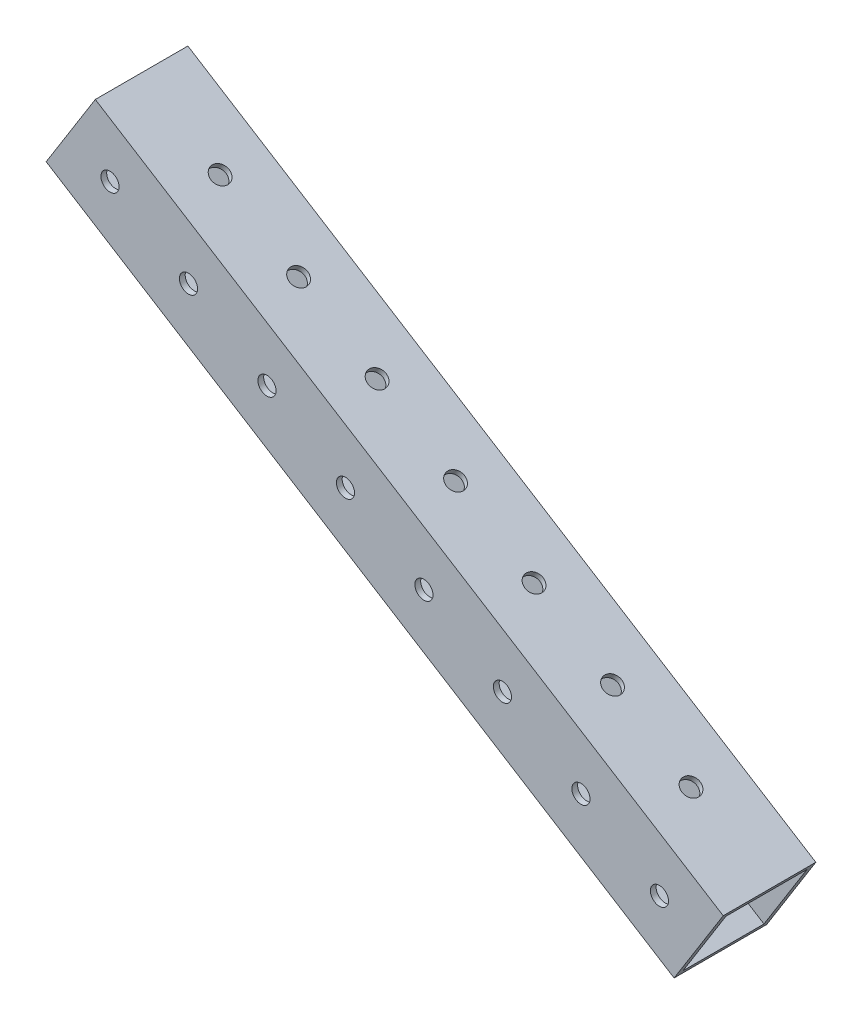
ISO-10303-21;
HEADER;
FILE_DESCRIPTION(('STEP AP214'),'2;1');
FILE_NAME('part.step','',(''),(''),'','','');
FILE_SCHEMA(('AUTOMOTIVE_DESIGN { 1 0 10303 214 1 1 1 1 }'));
ENDSEC;
DATA;
#1=APPLICATION_CONTEXT('core data for automotive mechanical design processes');
#2=APPLICATION_PROTOCOL_DEFINITION('international standard','automotive_design',2000,#1);
#3=PRODUCT_CONTEXT('',#1,'mechanical');
#4=PRODUCT('Part','Part','',(#3));
#5=PRODUCT_RELATED_PRODUCT_CATEGORY('part','',(#4));
#6=PRODUCT_DEFINITION_FORMATION('','',#4);
#7=PRODUCT_DEFINITION_CONTEXT('part definition',#1,'design');
#8=PRODUCT_DEFINITION('design','',#6,#7);
#9=PRODUCT_DEFINITION_SHAPE('','',#8);
#10=(LENGTH_UNIT() NAMED_UNIT(*) SI_UNIT(.MILLI.,.METRE.));
#11=(NAMED_UNIT(*) PLANE_ANGLE_UNIT() SI_UNIT($,.RADIAN.));
#12=(NAMED_UNIT(*) SI_UNIT($,.STERADIAN.) SOLID_ANGLE_UNIT());
#13=UNCERTAINTY_MEASURE_WITH_UNIT(LENGTH_MEASURE(1.E-05),#10,'distance_accuracy_value','');
#14=(GEOMETRIC_REPRESENTATION_CONTEXT(3) GLOBAL_UNCERTAINTY_ASSIGNED_CONTEXT((#13)) GLOBAL_UNIT_ASSIGNED_CONTEXT((#10,
#11,#12)) REPRESENTATION_CONTEXT('',''));
#15=CARTESIAN_POINT('',(0.,0.,0.));
#16=DIRECTION('',(0.,0.,1.));
#17=DIRECTION('',(1.,0.,0.));
#18=AXIS2_PLACEMENT_3D('',#15,#16,#17);
#19=CARTESIAN_POINT('',(108.430376731057,810.225785303285,25.4));
#20=DIRECTION('',(0.,0.,-1.));
#21=DIRECTION('',(-1.,0.,0.));
#22=AXIS2_PLACEMENT_3D('',#19,#20,#21);
#23=CYLINDRICAL_SURFACE('',#22,2.48919999999999);
#24=CARTESIAN_POINT('',(108.430376731057,810.225785303285,1.5875));
#25=DIRECTION('',(0.,0.,-1.));
#26=DIRECTION('',(0.,1.,0.));
#27=AXIS2_PLACEMENT_3D('',#24,#25,#26);
#28=CIRCLE('',#27,2.48919999999999);
#29=CARTESIAN_POINT('',(108.430376731057,812.714985303285,1.5875));
#30=VERTEX_POINT('',#29);
#31=EDGE_CURVE('E180',#30,#30,#28,.T.);
#32=ORIENTED_EDGE('',*,*,#31,.F.);
#33=EDGE_LOOP('',(#32));
#34=FACE_BOUND('',#33,.T.);
#35=CARTESIAN_POINT('',(108.430376731057,810.225785303285,0.));
#36=DIRECTION('',(0.,0.,1.));
#37=DIRECTION('',(1.,0.,0.));
#38=AXIS2_PLACEMENT_3D('',#35,#36,#37);
#39=CIRCLE('',#38,2.48919999999999);
#40=CARTESIAN_POINT('',(110.919576731057,810.225785303285,0.));
#41=VERTEX_POINT('',#40);
#42=EDGE_CURVE('E226',#41,#41,#39,.T.);
#43=ORIENTED_EDGE('',*,*,#42,.F.);
#44=EDGE_LOOP('',(#43));
#45=FACE_BOUND('',#44,.T.);
#46=ADVANCED_FACE('F43',(#34,#45),#23,.F.);
#47=CARTESIAN_POINT('',(129.961835950274,796.751503730926,25.4));
#48=DIRECTION('',(0.,0.,-1.));
#49=DIRECTION('',(-1.,0.,0.));
#50=AXIS2_PLACEMENT_3D('',#47,#48,#49);
#51=CYLINDRICAL_SURFACE('',#50,2.48919999999999);
#52=CARTESIAN_POINT('',(129.961835950274,796.751503730926,1.5875));
#53=DIRECTION('',(0.,0.,-1.));
#54=DIRECTION('',(0.,1.,0.));
#55=AXIS2_PLACEMENT_3D('',#52,#53,#54);
#56=CIRCLE('',#55,2.48919999999999);
#57=CARTESIAN_POINT('',(129.961835950274,799.240703730926,1.5875));
#58=VERTEX_POINT('',#57);
#59=EDGE_CURVE('E177',#58,#58,#56,.T.);
#60=ORIENTED_EDGE('',*,*,#59,.F.);
#61=EDGE_LOOP('',(#60));
#62=FACE_BOUND('',#61,.T.);
#63=CARTESIAN_POINT('',(129.961835950274,796.751503730926,0.));
#64=DIRECTION('',(0.,0.,1.));
#65=DIRECTION('',(1.,0.,0.));
#66=AXIS2_PLACEMENT_3D('',#63,#64,#65);
#67=CIRCLE('',#66,2.48919999999999);
#68=CARTESIAN_POINT('',(132.451035950274,796.751503730926,0.));
#69=VERTEX_POINT('',#68);
#70=EDGE_CURVE('E220',#69,#69,#67,.T.);
#71=ORIENTED_EDGE('',*,*,#70,.F.);
#72=EDGE_LOOP('',(#71));
#73=FACE_BOUND('',#72,.T.);
#74=ADVANCED_FACE('F361',(#62,#73),#51,.F.);
#75=CARTESIAN_POINT('',(151.49329516949,783.277222158567,25.4));
#76=DIRECTION('',(0.,0.,-1.));
#77=DIRECTION('',(-1.,0.,0.));
#78=AXIS2_PLACEMENT_3D('',#75,#76,#77);
#79=CYLINDRICAL_SURFACE('',#78,2.48919999999999);
#80=CARTESIAN_POINT('',(151.49329516949,783.277222158567,1.5875));
#81=DIRECTION('',(0.,0.,-1.));
#82=DIRECTION('',(0.,1.,0.));
#83=AXIS2_PLACEMENT_3D('',#80,#81,#82);
#84=CIRCLE('',#83,2.48919999999999);
#85=CARTESIAN_POINT('',(151.49329516949,785.766422158567,1.5875));
#86=VERTEX_POINT('',#85);
#87=EDGE_CURVE('E174',#86,#86,#84,.T.);
#88=ORIENTED_EDGE('',*,*,#87,.F.);
#89=EDGE_LOOP('',(#88));
#90=FACE_BOUND('',#89,.T.);
#91=CARTESIAN_POINT('',(151.49329516949,783.277222158567,0.));
#92=DIRECTION('',(0.,0.,1.));
#93=DIRECTION('',(1.,0.,0.));
#94=AXIS2_PLACEMENT_3D('',#91,#92,#93);
#95=CIRCLE('',#94,2.48919999999999);
#96=CARTESIAN_POINT('',(153.98249516949,783.277222158567,0.));
#97=VERTEX_POINT('',#96);
#98=EDGE_CURVE('E214',#97,#97,#95,.T.);
#99=ORIENTED_EDGE('',*,*,#98,.F.);
#100=EDGE_LOOP('',(#99));
#101=FACE_BOUND('',#100,.T.);
#102=ADVANCED_FACE('F367',(#90,#101),#79,.F.);
#103=CARTESIAN_POINT('',(173.024754388706,769.802940586208,25.4));
#104=DIRECTION('',(0.,0.,-1.));
#105=DIRECTION('',(-1.,0.,0.));
#106=AXIS2_PLACEMENT_3D('',#103,#104,#105);
#107=CYLINDRICAL_SURFACE('',#106,2.48919999999999);
#108=CARTESIAN_POINT('',(173.024754388706,769.802940586208,1.5875));
#109=DIRECTION('',(0.,0.,-1.));
#110=DIRECTION('',(0.,1.,0.));
#111=AXIS2_PLACEMENT_3D('',#108,#109,#110);
#112=CIRCLE('',#111,2.48919999999999);
#113=CARTESIAN_POINT('',(173.024754388706,772.292140586208,1.5875));
#114=VERTEX_POINT('',#113);
#115=EDGE_CURVE('E171',#114,#114,#112,.T.);
#116=ORIENTED_EDGE('',*,*,#115,.F.);
#117=EDGE_LOOP('',(#116));
#118=FACE_BOUND('',#117,.T.);
#119=CARTESIAN_POINT('',(173.024754388706,769.802940586208,0.));
#120=DIRECTION('',(0.,0.,1.));
#121=DIRECTION('',(1.,0.,0.));
#122=AXIS2_PLACEMENT_3D('',#119,#120,#121);
#123=CIRCLE('',#122,2.48919999999999);
#124=CARTESIAN_POINT('',(175.513954388706,769.802940586208,0.));
#125=VERTEX_POINT('',#124);
#126=EDGE_CURVE('E208',#125,#125,#123,.T.);
#127=ORIENTED_EDGE('',*,*,#126,.F.);
#128=EDGE_LOOP('',(#127));
#129=FACE_BOUND('',#128,.T.);
#130=ADVANCED_FACE('F443',(#118,#129),#107,.F.);
#131=CARTESIAN_POINT('',(194.556213607923,756.328659013849,25.4));
#132=DIRECTION('',(0.,0.,-1.));
#133=DIRECTION('',(-1.,0.,0.));
#134=AXIS2_PLACEMENT_3D('',#131,#132,#133);
#135=CYLINDRICAL_SURFACE('',#134,2.48919999999999);
#136=CARTESIAN_POINT('',(194.556213607923,756.328659013849,1.5875));
#137=DIRECTION('',(0.,0.,-1.));
#138=DIRECTION('',(0.,1.,0.));
#139=AXIS2_PLACEMENT_3D('',#136,#137,#138);
#140=CIRCLE('',#139,2.48919999999999);
#141=CARTESIAN_POINT('',(194.556213607923,758.817859013849,1.5875));
#142=VERTEX_POINT('',#141);
#143=EDGE_CURVE('E168',#142,#142,#140,.T.);
#144=ORIENTED_EDGE('',*,*,#143,.F.);
#145=EDGE_LOOP('',(#144));
#146=FACE_BOUND('',#145,.T.);
#147=CARTESIAN_POINT('',(194.556213607923,756.328659013849,0.));
#148=DIRECTION('',(0.,0.,1.));
#149=DIRECTION('',(1.,0.,0.));
#150=AXIS2_PLACEMENT_3D('',#147,#148,#149);
#151=CIRCLE('',#150,2.48919999999999);
#152=CARTESIAN_POINT('',(197.045413607923,756.328659013849,0.));
#153=VERTEX_POINT('',#152);
#154=EDGE_CURVE('E202',#153,#153,#151,.T.);
#155=ORIENTED_EDGE('',*,*,#154,.F.);
#156=EDGE_LOOP('',(#155));
#157=FACE_BOUND('',#156,.T.);
#158=ADVANCED_FACE('F449',(#146,#157),#135,.F.);
#159=CARTESIAN_POINT('',(216.087672827139,742.854377441489,25.4));
#160=DIRECTION('',(0.,0.,-1.));
#161=DIRECTION('',(-1.,0.,0.));
#162=AXIS2_PLACEMENT_3D('',#159,#160,#161);
#163=CYLINDRICAL_SURFACE('',#162,2.48919999999999);
#164=CARTESIAN_POINT('',(216.087672827139,742.854377441489,1.5875));
#165=DIRECTION('',(0.,0.,-1.));
#166=DIRECTION('',(0.,1.,0.));
#167=AXIS2_PLACEMENT_3D('',#164,#165,#166);
#168=CIRCLE('',#167,2.48919999999999);
#169=CARTESIAN_POINT('',(216.087672827139,745.343577441489,1.5875));
#170=VERTEX_POINT('',#169);
#171=EDGE_CURVE('E165',#170,#170,#168,.T.);
#172=ORIENTED_EDGE('',*,*,#171,.F.);
#173=EDGE_LOOP('',(#172));
#174=FACE_BOUND('',#173,.T.);
#175=CARTESIAN_POINT('',(216.087672827139,742.854377441489,0.));
#176=DIRECTION('',(0.,0.,1.));
#177=DIRECTION('',(1.,0.,0.));
#178=AXIS2_PLACEMENT_3D('',#175,#176,#177);
#179=CIRCLE('',#178,2.48919999999999);
#180=CARTESIAN_POINT('',(218.576872827139,742.854377441489,0.));
#181=VERTEX_POINT('',#180);
#182=EDGE_CURVE('E196',#181,#181,#179,.T.);
#183=ORIENTED_EDGE('',*,*,#182,.F.);
#184=EDGE_LOOP('',(#183));
#185=FACE_BOUND('',#184,.T.);
#186=ADVANCED_FACE('F424',(#174,#185),#163,.F.);
#187=CARTESIAN_POINT('',(237.619132046355,729.38009586913,25.4));
#188=DIRECTION('',(0.,0.,-1.));
#189=DIRECTION('',(-1.,0.,0.));
#190=AXIS2_PLACEMENT_3D('',#187,#188,#189);
#191=CYLINDRICAL_SURFACE('',#190,2.48919999999999);
#192=CARTESIAN_POINT('',(237.619132046355,729.38009586913,1.5875));
#193=DIRECTION('',(0.,0.,-1.));
#194=DIRECTION('',(0.,1.,0.));
#195=AXIS2_PLACEMENT_3D('',#192,#193,#194);
#196=CIRCLE('',#195,2.48919999999999);
#197=CARTESIAN_POINT('',(237.619132046355,731.86929586913,1.5875));
#198=VERTEX_POINT('',#197);
#199=EDGE_CURVE('E162',#198,#198,#196,.T.);
#200=ORIENTED_EDGE('',*,*,#199,.F.);
#201=EDGE_LOOP('',(#200));
#202=FACE_BOUND('',#201,.T.);
#203=CARTESIAN_POINT('',(237.619132046355,729.38009586913,0.));
#204=DIRECTION('',(0.,0.,1.));
#205=DIRECTION('',(1.,0.,0.));
#206=AXIS2_PLACEMENT_3D('',#203,#204,#205);
#207=CIRCLE('',#206,2.48919999999999);
#208=CARTESIAN_POINT('',(240.108332046355,729.38009586913,0.));
#209=VERTEX_POINT('',#208);
#210=EDGE_CURVE('E190',#209,#209,#207,.T.);
#211=ORIENTED_EDGE('',*,*,#210,.F.);
#212=EDGE_LOOP('',(#211));
#213=FACE_BOUND('',#212,.T.);
#214=ADVANCED_FACE('F416',(#202,#213),#191,.F.);
#215=CARTESIAN_POINT('',(259.150591265572,715.905814296771,25.4));
#216=DIRECTION('',(0.,0.,-1.));
#217=DIRECTION('',(-1.,0.,0.));
#218=AXIS2_PLACEMENT_3D('',#215,#216,#217);
#219=CYLINDRICAL_SURFACE('',#218,2.48919999999994);
#220=CARTESIAN_POINT('',(259.150591265572,715.905814296771,1.5875));
#221=DIRECTION('',(0.,0.,-1.));
#222=DIRECTION('',(0.,1.,0.));
#223=AXIS2_PLACEMENT_3D('',#220,#221,#222);
#224=CIRCLE('',#223,2.48919999999994);
#225=CARTESIAN_POINT('',(259.150591265572,718.395014296771,1.5875));
#226=VERTEX_POINT('',#225);
#227=EDGE_CURVE('E161',#226,#226,#224,.T.);
#228=ORIENTED_EDGE('',*,*,#227,.F.);
#229=EDGE_LOOP('',(#228));
#230=FACE_BOUND('',#229,.T.);
#231=CARTESIAN_POINT('',(259.150591265572,715.905814296771,0.));
#232=DIRECTION('',(0.,0.,1.));
#233=DIRECTION('',(1.,0.,0.));
#234=AXIS2_PLACEMENT_3D('',#231,#232,#233);
#235=CIRCLE('',#234,2.48919999999994);
#236=CARTESIAN_POINT('',(261.639791265572,715.905814296771,0.));
#237=VERTEX_POINT('',#236);
#238=EDGE_CURVE('E186',#237,#237,#235,.T.);
#239=ORIENTED_EDGE('',*,*,#238,.F.);
#240=EDGE_LOOP('',(#239));
#241=FACE_BOUND('',#240,.T.);
#242=ADVANCED_FACE('F386',(#230,#241),#219,.F.);
#243=CARTESIAN_POINT('',(0.,0.,25.4));
#244=DIRECTION('',(0.,0.,-1.));
#245=DIRECTION('',(-1.,0.,0.));
#246=AXIS2_PLACEMENT_3D('',#243,#244,#245);
#247=PLANE('',#246);
#248=DIRECTION('',(-0.847695244851041,0.530483526470835,0.));
#249=VECTOR('',#248,1.);
#250=CARTESIAN_POINT('',(104.401787907629,827.728655699073,25.4));
#251=LINE('',#250,#249);
#252=CARTESIAN_POINT('',(276.65346166136,719.934403120199,25.4));
#253=VERTEX_POINT('',#252);
#254=CARTESIAN_POINT('',(104.401787907629,827.728655699073,25.4));
#255=VERTEX_POINT('',#254);
#256=EDGE_CURVE('E235',#253,#255,#251,.T.);
#257=ORIENTED_EDGE('',*,*,#256,.T.);
#258=DIRECTION('',(-0.530483526470836,-0.847695244851041,0.));
#259=VECTOR('',#258,1.);
#260=CARTESIAN_POINT('',(90.9275063352693,806.197196479857,25.4));
#261=LINE('',#260,#259);
#262=CARTESIAN_POINT('',(90.9275063352693,806.197196479857,25.4));
#263=VERTEX_POINT('',#262);
#264=EDGE_CURVE('E238',#255,#263,#261,.T.);
#265=ORIENTED_EDGE('',*,*,#264,.T.);
#266=DIRECTION('',(0.847695244851041,-0.530483526470835,0.));
#267=VECTOR('',#266,1.);
#268=CARTESIAN_POINT('',(263.179180089001,698.402943900983,25.4));
#269=LINE('',#268,#267);
#270=CARTESIAN_POINT('',(263.179180089001,698.402943900983,25.4));
#271=VERTEX_POINT('',#270);
#272=EDGE_CURVE('E241',#263,#271,#269,.T.);
#273=ORIENTED_EDGE('',*,*,#272,.T.);
#274=DIRECTION('',(0.530483526470835,0.847695244851041,0.));
#275=VECTOR('',#274,1.);
#276=CARTESIAN_POINT('',(276.65346166136,719.934403120199,25.4));
#277=LINE('',#276,#275);
#278=EDGE_CURVE('E243',#271,#253,#277,.T.);
#279=ORIENTED_EDGE('',*,*,#278,.T.);
#280=EDGE_LOOP('',(#257,#265,#273,#279));
#281=FACE_BOUND('',#280,.T.);
#282=CARTESIAN_POINT('',(108.430376731057,810.225785303285,25.4));
#283=DIRECTION('',(0.,0.,1.));
#284=DIRECTION('',(1.,0.,0.));
#285=AXIS2_PLACEMENT_3D('',#282,#283,#284);
#286=CIRCLE('',#285,2.48919999999999);
#287=CARTESIAN_POINT('',(110.919576731057,810.225785303285,25.4));
#288=VERTEX_POINT('',#287);
#289=EDGE_CURVE('E229',#288,#288,#286,.T.);
#290=ORIENTED_EDGE('',*,*,#289,.F.);
#291=EDGE_LOOP('',(#290));
#292=FACE_BOUND('',#291,.T.);
#293=CARTESIAN_POINT('',(129.961835950274,796.751503730926,25.4));
#294=DIRECTION('',(0.,0.,1.));
#295=DIRECTION('',(1.,0.,0.));
#296=AXIS2_PLACEMENT_3D('',#293,#294,#295);
#297=CIRCLE('',#296,2.48919999999999);
#298=CARTESIAN_POINT('',(132.451035950274,796.751503730926,25.4));
#299=VERTEX_POINT('',#298);
#300=EDGE_CURVE('E223',#299,#299,#297,.T.);
#301=ORIENTED_EDGE('',*,*,#300,.F.);
#302=EDGE_LOOP('',(#301));
#303=FACE_BOUND('',#302,.T.);
#304=CARTESIAN_POINT('',(151.49329516949,783.277222158567,25.4));
#305=DIRECTION('',(0.,0.,1.));
#306=DIRECTION('',(1.,0.,0.));
#307=AXIS2_PLACEMENT_3D('',#304,#305,#306);
#308=CIRCLE('',#307,2.48919999999999);
#309=CARTESIAN_POINT('',(153.98249516949,783.277222158567,25.4));
#310=VERTEX_POINT('',#309);
#311=EDGE_CURVE('E217',#310,#310,#308,.T.);
#312=ORIENTED_EDGE('',*,*,#311,.F.);
#313=EDGE_LOOP('',(#312));
#314=FACE_BOUND('',#313,.T.);
#315=CARTESIAN_POINT('',(173.024754388706,769.802940586208,25.4));
#316=DIRECTION('',(0.,0.,1.));
#317=DIRECTION('',(1.,0.,0.));
#318=AXIS2_PLACEMENT_3D('',#315,#316,#317);
#319=CIRCLE('',#318,2.48919999999999);
#320=CARTESIAN_POINT('',(175.513954388706,769.802940586208,25.4));
#321=VERTEX_POINT('',#320);
#322=EDGE_CURVE('E211',#321,#321,#319,.T.);
#323=ORIENTED_EDGE('',*,*,#322,.F.);
#324=EDGE_LOOP('',(#323));
#325=FACE_BOUND('',#324,.T.);
#326=CARTESIAN_POINT('',(194.556213607923,756.328659013849,25.4));
#327=DIRECTION('',(0.,0.,1.));
#328=DIRECTION('',(1.,0.,0.));
#329=AXIS2_PLACEMENT_3D('',#326,#327,#328);
#330=CIRCLE('',#329,2.48919999999999);
#331=CARTESIAN_POINT('',(197.045413607923,756.328659013849,25.4));
#332=VERTEX_POINT('',#331);
#333=EDGE_CURVE('E205',#332,#332,#330,.T.);
#334=ORIENTED_EDGE('',*,*,#333,.F.);
#335=EDGE_LOOP('',(#334));
#336=FACE_BOUND('',#335,.T.);
#337=CARTESIAN_POINT('',(216.087672827139,742.854377441489,25.4));
#338=DIRECTION('',(0.,0.,1.));
#339=DIRECTION('',(1.,0.,0.));
#340=AXIS2_PLACEMENT_3D('',#337,#338,#339);
#341=CIRCLE('',#340,2.48919999999999);
#342=CARTESIAN_POINT('',(218.576872827139,742.854377441489,25.4));
#343=VERTEX_POINT('',#342);
#344=EDGE_CURVE('E199',#343,#343,#341,.T.);
#345=ORIENTED_EDGE('',*,*,#344,.F.);
#346=EDGE_LOOP('',(#345));
#347=FACE_BOUND('',#346,.T.);
#348=CARTESIAN_POINT('',(237.619132046355,729.38009586913,25.4));
#349=DIRECTION('',(0.,0.,1.));
#350=DIRECTION('',(1.,0.,0.));
#351=AXIS2_PLACEMENT_3D('',#348,#349,#350);
#352=CIRCLE('',#351,2.48919999999999);
#353=CARTESIAN_POINT('',(240.108332046355,729.38009586913,25.4));
#354=VERTEX_POINT('',#353);
#355=EDGE_CURVE('E193',#354,#354,#352,.T.);
#356=ORIENTED_EDGE('',*,*,#355,.F.);
#357=EDGE_LOOP('',(#356));
#358=FACE_BOUND('',#357,.T.);
#359=CARTESIAN_POINT('',(259.150591265572,715.905814296771,25.4));
#360=DIRECTION('',(0.,0.,1.));
#361=DIRECTION('',(1.,0.,0.));
#362=AXIS2_PLACEMENT_3D('',#359,#360,#361);
#363=CIRCLE('',#362,2.48919999999994);
#364=CARTESIAN_POINT('',(261.639791265572,715.905814296771,25.4));
#365=VERTEX_POINT('',#364);
#366=EDGE_CURVE('E187',#365,#365,#363,.T.);
#367=ORIENTED_EDGE('',*,*,#366,.F.);
#368=EDGE_LOOP('',(#367));
#369=FACE_BOUND('',#368,.T.);
#370=ADVANCED_FACE('F342',(#281,#292,#303,#314,#325,#336,#347,#358,#369),#247,.F.);
#371=CARTESIAN_POINT('',(0.,0.,0.));
#372=DIRECTION('',(0.,0.,-1.));
#373=DIRECTION('',(-1.,0.,0.));
#374=AXIS2_PLACEMENT_3D('',#371,#372,#373);
#375=PLANE('',#374);
#376=ORIENTED_EDGE('',*,*,#210,.T.);
#377=EDGE_LOOP('',(#376));
#378=FACE_BOUND('',#377,.T.);
#379=ORIENTED_EDGE('',*,*,#154,.T.);
#380=EDGE_LOOP('',(#379));
#381=FACE_BOUND('',#380,.T.);
#382=ORIENTED_EDGE('',*,*,#98,.T.);
#383=EDGE_LOOP('',(#382));
#384=FACE_BOUND('',#383,.T.);
#385=ORIENTED_EDGE('',*,*,#42,.T.);
#386=EDGE_LOOP('',(#385));
#387=FACE_BOUND('',#386,.T.);
#388=DIRECTION('',(-0.847695244851041,0.530483526470835,0.));
#389=VECTOR('',#388,1.);
#390=CARTESIAN_POINT('',(104.401787907629,827.728655699073,0.));
#391=LINE('',#390,#389);
#392=CARTESIAN_POINT('',(276.65346166136,719.934403120199,0.));
#393=VERTEX_POINT('',#392);
#394=CARTESIAN_POINT('',(104.401787907629,827.728655699073,0.));
#395=VERTEX_POINT('',#394);
#396=EDGE_CURVE('E232',#393,#395,#391,.T.);
#397=ORIENTED_EDGE('',*,*,#396,.F.);
#398=DIRECTION('',(0.530483526470835,0.847695244851041,0.));
#399=VECTOR('',#398,1.);
#400=CARTESIAN_POINT('',(276.65346166136,719.934403120199,0.));
#401=LINE('',#400,#399);
#402=CARTESIAN_POINT('',(263.179180089001,698.402943900983,0.));
#403=VERTEX_POINT('',#402);
#404=EDGE_CURVE('E239',#403,#393,#401,.T.);
#405=ORIENTED_EDGE('',*,*,#404,.F.);
#406=DIRECTION('',(0.847695244851041,-0.530483526470835,0.));
#407=VECTOR('',#406,1.);
#408=CARTESIAN_POINT('',(263.179180089001,698.402943900983,0.));
#409=LINE('',#408,#407);
#410=CARTESIAN_POINT('',(90.9275063352693,806.197196479857,0.));
#411=VERTEX_POINT('',#410);
#412=EDGE_CURVE('E250',#411,#403,#409,.T.);
#413=ORIENTED_EDGE('',*,*,#412,.F.);
#414=DIRECTION('',(-0.530483526470836,-0.847695244851041,0.));
#415=VECTOR('',#414,1.);
#416=CARTESIAN_POINT('',(90.9275063352693,806.197196479857,0.));
#417=LINE('',#416,#415);
#418=EDGE_CURVE('E248',#395,#411,#417,.T.);
#419=ORIENTED_EDGE('',*,*,#418,.F.);
#420=EDGE_LOOP('',(#397,#405,#413,#419));
#421=FACE_BOUND('',#420,.T.);
#422=ORIENTED_EDGE('',*,*,#70,.T.);
#423=EDGE_LOOP('',(#422));
#424=FACE_BOUND('',#423,.T.);
#425=ORIENTED_EDGE('',*,*,#126,.T.);
#426=EDGE_LOOP('',(#425));
#427=FACE_BOUND('',#426,.T.);
#428=ORIENTED_EDGE('',*,*,#182,.T.);
#429=EDGE_LOOP('',(#428));
#430=FACE_BOUND('',#429,.T.);
#431=ORIENTED_EDGE('',*,*,#238,.T.);
#432=EDGE_LOOP('',(#431));
#433=FACE_BOUND('',#432,.T.);
#434=ADVANCED_FACE('F318',(#378,#381,#384,#387,#421,#424,#427,#430,#433),#375,.T.);
#435=CARTESIAN_POINT('',(104.401787907629,827.728655699073,25.4));
#436=DIRECTION('',(-0.530483526470836,-0.847695244851041,0.));
#437=DIRECTION('',(0.847695244851041,-0.530483526470836,0.));
#438=AXIS2_PLACEMENT_3D('',#435,#436,#437);
#439=PLANE('',#438);
#440=CARTESIAN_POINT('',(125.933247126845,814.254374126714,12.7));
#441=DIRECTION('',(0.530483526470836,0.847695244851041,0.));
#442=DIRECTION('',(-0.847695244851041,0.530483526470836,0.));
#443=AXIS2_PLACEMENT_3D('',#440,#441,#442);
#444=CIRCLE('',#443,2.48920000000003);
#445=CARTESIAN_POINT('',(123.823164123362,815.574853720805,12.7));
#446=VERTEX_POINT('',#445);
#447=EDGE_CURVE('E273',#446,#446,#444,.T.);
#448=ORIENTED_EDGE('',*,*,#447,.F.);
#449=EDGE_LOOP('',(#448));
#450=FACE_BOUND('',#449,.T.);
#451=CARTESIAN_POINT('',(147.464706346061,800.780092554355,12.7));
#452=DIRECTION('',(0.530483526470836,0.847695244851041,0.));
#453=DIRECTION('',(-0.847695244851041,0.530483526470836,0.));
#454=AXIS2_PLACEMENT_3D('',#451,#452,#453);
#455=CIRCLE('',#454,2.48919999999998);
#456=CARTESIAN_POINT('',(145.354623342578,802.100572148446,12.7));
#457=VERTEX_POINT('',#456);
#458=EDGE_CURVE('E307',#457,#457,#455,.T.);
#459=ORIENTED_EDGE('',*,*,#458,.F.);
#460=EDGE_LOOP('',(#459));
#461=FACE_BOUND('',#460,.T.);
#462=CARTESIAN_POINT('',(168.996165565278,787.305810981996,12.7));
#463=DIRECTION('',(0.530483526470836,0.847695244851041,0.));
#464=DIRECTION('',(-0.847695244851041,0.530483526470836,0.));
#465=AXIS2_PLACEMENT_3D('',#462,#463,#464);
#466=CIRCLE('',#465,2.48920000000006);
#467=CARTESIAN_POINT('',(166.886082561795,788.626290576087,12.7));
#468=VERTEX_POINT('',#467);
#469=EDGE_CURVE('E304',#468,#468,#466,.T.);
#470=ORIENTED_EDGE('',*,*,#469,.F.);
#471=EDGE_LOOP('',(#470));
#472=FACE_BOUND('',#471,.T.);
#473=CARTESIAN_POINT('',(190.527624784494,773.831529409636,12.7));
#474=DIRECTION('',(0.530483526470836,0.847695244851041,0.));
#475=DIRECTION('',(-0.847695244851041,0.530483526470836,0.));
#476=AXIS2_PLACEMENT_3D('',#473,#474,#475);
#477=CIRCLE('',#476,2.4892);
#478=CARTESIAN_POINT('',(188.417541781011,775.152009003728,12.7));
#479=VERTEX_POINT('',#478);
#480=EDGE_CURVE('E301',#479,#479,#477,.T.);
#481=ORIENTED_EDGE('',*,*,#480,.F.);
#482=EDGE_LOOP('',(#481));
#483=FACE_BOUND('',#482,.T.);
#484=CARTESIAN_POINT('',(212.059084003711,760.357247837277,12.7));
#485=DIRECTION('',(0.530483526470836,0.847695244851041,0.));
#486=DIRECTION('',(-0.847695244851041,0.530483526470836,0.));
#487=AXIS2_PLACEMENT_3D('',#484,#485,#486);
#488=CIRCLE('',#487,2.4892);
#489=CARTESIAN_POINT('',(209.949001000227,761.677727431368,12.7));
#490=VERTEX_POINT('',#489);
#491=EDGE_CURVE('E298',#490,#490,#488,.T.);
#492=ORIENTED_EDGE('',*,*,#491,.F.);
#493=EDGE_LOOP('',(#492));
#494=FACE_BOUND('',#493,.T.);
#495=CARTESIAN_POINT('',(233.590543222927,746.882966264918,12.7));
#496=DIRECTION('',(0.530483526470836,0.847695244851041,0.));
#497=DIRECTION('',(-0.847695244851041,0.530483526470836,0.));
#498=AXIS2_PLACEMENT_3D('',#495,#496,#497);
#499=CIRCLE('',#498,2.48920000000004);
#500=CARTESIAN_POINT('',(231.480460219444,748.203445859009,12.7));
#501=VERTEX_POINT('',#500);
#502=EDGE_CURVE('E295',#501,#501,#499,.T.);
#503=ORIENTED_EDGE('',*,*,#502,.F.);
#504=EDGE_LOOP('',(#503));
#505=FACE_BOUND('',#504,.T.);
#506=CARTESIAN_POINT('',(255.122002442144,733.408684692559,12.7));
#507=DIRECTION('',(0.530483526470836,0.847695244851041,0.));
#508=DIRECTION('',(-0.847695244851041,0.530483526470836,0.));
#509=AXIS2_PLACEMENT_3D('',#506,#507,#508);
#510=CIRCLE('',#509,2.48919999999998);
#511=CARTESIAN_POINT('',(253.01191943866,734.72916428665,12.7));
#512=VERTEX_POINT('',#511);
#513=EDGE_CURVE('E292',#512,#512,#510,.T.);
#514=ORIENTED_EDGE('',*,*,#513,.F.);
#515=EDGE_LOOP('',(#514));
#516=FACE_BOUND('',#515,.T.);
#517=ORIENTED_EDGE('',*,*,#396,.T.);
#518=DIRECTION('',(0.,0.,-1.));
#519=VECTOR('',#518,1.);
#520=CARTESIAN_POINT('',(104.401787907629,827.728655699073,25.4));
#521=LINE('',#520,#519);
#522=EDGE_CURVE('E261',#255,#395,#521,.T.);
#523=ORIENTED_EDGE('',*,*,#522,.F.);
#524=ORIENTED_EDGE('',*,*,#256,.F.);
#525=DIRECTION('',(0.,0.,-1.));
#526=VECTOR('',#525,1.);
#527=CARTESIAN_POINT('',(276.65346166136,719.934403120199,25.4));
#528=LINE('',#527,#526);
#529=EDGE_CURVE('E245',#253,#393,#528,.T.);
#530=ORIENTED_EDGE('',*,*,#529,.T.);
#531=EDGE_LOOP('',(#517,#523,#524,#530));
#532=FACE_BOUND('',#531,.T.);
#533=ADVANCED_FACE('F45',(#450,#461,#472,#483,#494,#505,#516,#532),#439,.F.);
#534=CARTESIAN_POINT('',(90.9275063352693,806.197196479857,25.4));
#535=DIRECTION('',(0.847695244851041,-0.530483526470836,0.));
#536=DIRECTION('',(0.530483526470836,0.847695244851041,0.));
#537=AXIS2_PLACEMENT_3D('',#534,#535,#536);
#538=PLANE('',#537);
#539=DIRECTION('',(0.,0.,1.));
#540=VECTOR('',#539,1.);
#541=CARTESIAN_POINT('',(91.7696489335416,807.542912681058,1.5875));
#542=LINE('',#541,#540);
#543=CARTESIAN_POINT('',(91.7696489335419,807.542912681058,1.58750000000001));
#544=VERTEX_POINT('',#543);
#545=CARTESIAN_POINT('',(91.7696489335416,807.542912681058,23.8125));
#546=VERTEX_POINT('',#545);
#547=EDGE_CURVE('E122',#544,#546,#542,.T.);
#548=ORIENTED_EDGE('',*,*,#547,.F.);
#549=DIRECTION('',(-0.530483526470836,-0.847695244851041,0.));
#550=VECTOR('',#549,1.);
#551=CARTESIAN_POINT('',(103.559645309356,826.382939497873,1.5875));
#552=LINE('',#551,#550);
#553=CARTESIAN_POINT('',(103.559645309356,826.382939497873,1.5875));
#554=VERTEX_POINT('',#553);
#555=EDGE_CURVE('E60',#554,#544,#552,.T.);
#556=ORIENTED_EDGE('',*,*,#555,.F.);
#557=DIRECTION('',(0.,0.,-1.));
#558=VECTOR('',#557,1.);
#559=CARTESIAN_POINT('',(103.559645309356,826.382939497873,1.5875));
#560=LINE('',#559,#558);
#561=CARTESIAN_POINT('',(103.559645309356,826.382939497873,23.8125));
#562=VERTEX_POINT('',#561);
#563=EDGE_CURVE('E129',#562,#554,#560,.T.);
#564=ORIENTED_EDGE('',*,*,#563,.F.);
#565=DIRECTION('',(0.530483526470836,0.847695244851041,0.));
#566=VECTOR('',#565,1.);
#567=CARTESIAN_POINT('',(103.559645309356,826.382939497873,23.8125));
#568=LINE('',#567,#566);
#569=EDGE_CURVE('E113',#546,#562,#568,.T.);
#570=ORIENTED_EDGE('',*,*,#569,.F.);
#571=EDGE_LOOP('',(#548,#556,#564,#570));
#572=FACE_BOUND('',#571,.T.);
#573=ORIENTED_EDGE('',*,*,#418,.T.);
#574=DIRECTION('',(0.,0.,-1.));
#575=VECTOR('',#574,1.);
#576=CARTESIAN_POINT('',(90.9275063352693,806.197196479857,25.4));
#577=LINE('',#576,#575);
#578=EDGE_CURVE('E258',#263,#411,#577,.T.);
#579=ORIENTED_EDGE('',*,*,#578,.F.);
#580=ORIENTED_EDGE('',*,*,#264,.F.);
#581=ORIENTED_EDGE('',*,*,#522,.T.);
#582=EDGE_LOOP('',(#573,#579,#580,#581));
#583=FACE_BOUND('',#582,.T.);
#584=ADVANCED_FACE('F126',(#572,#583),#538,.F.);
#585=CARTESIAN_POINT('',(263.179180089001,698.402943900983,25.4));
#586=DIRECTION('',(0.530483526470835,0.847695244851041,0.));
#587=DIRECTION('',(-0.847695244851042,0.530483526470835,0.));
#588=AXIS2_PLACEMENT_3D('',#585,#586,#587);
#589=PLANE('',#588);
#590=ORIENTED_EDGE('',*,*,#412,.T.);
#591=DIRECTION('',(0.,0.,-1.));
#592=VECTOR('',#591,1.);
#593=CARTESIAN_POINT('',(263.179180089001,698.402943900983,25.4));
#594=LINE('',#593,#592);
#595=EDGE_CURVE('E255',#271,#403,#594,.T.);
#596=ORIENTED_EDGE('',*,*,#595,.F.);
#597=ORIENTED_EDGE('',*,*,#272,.F.);
#598=ORIENTED_EDGE('',*,*,#578,.T.);
#599=EDGE_LOOP('',(#590,#596,#597,#598));
#600=FACE_BOUND('',#599,.T.);
#601=ADVANCED_FACE('F349',(#600),#589,.F.);
#602=CARTESIAN_POINT('',(276.65346166136,719.934403120199,25.4));
#603=DIRECTION('',(-0.847695244851041,0.530483526470836,0.));
#604=DIRECTION('',(-0.530483526470836,-0.847695244851041,0.));
#605=AXIS2_PLACEMENT_3D('',#602,#603,#604);
#606=PLANE('',#605);
#607=DIRECTION('',(0.,0.,-1.));
#608=VECTOR('',#607,1.);
#609=CARTESIAN_POINT('',(275.811319063088,718.588686918999,25.4));
#610=LINE('',#609,#608);
#611=CARTESIAN_POINT('',(275.811319063088,718.588686918999,23.8125));
#612=VERTEX_POINT('',#611);
#613=CARTESIAN_POINT('',(275.811319063088,718.588686918999,1.5875));
#614=VERTEX_POINT('',#613);
#615=EDGE_CURVE('E11',#612,#614,#610,.T.);
#616=ORIENTED_EDGE('',*,*,#615,.T.);
#617=DIRECTION('',(-0.530483526470836,-0.847695244851041,0.));
#618=VECTOR('',#617,1.);
#619=CARTESIAN_POINT('',(276.65346166136,719.934403120199,1.5875));
#620=LINE('',#619,#618);
#621=CARTESIAN_POINT('',(264.021322687273,699.748660102184,1.5875));
#622=VERTEX_POINT('',#621);
#623=EDGE_CURVE('E183',#614,#622,#620,.T.);
#624=ORIENTED_EDGE('',*,*,#623,.T.);
#625=DIRECTION('',(0.,0.,1.));
#626=VECTOR('',#625,1.);
#627=CARTESIAN_POINT('',(264.021322687273,699.748660102184,25.4));
#628=LINE('',#627,#626);
#629=CARTESIAN_POINT('',(264.021322687273,699.748660102184,23.8125));
#630=VERTEX_POINT('',#629);
#631=EDGE_CURVE('E52',#622,#630,#628,.T.);
#632=ORIENTED_EDGE('',*,*,#631,.T.);
#633=DIRECTION('',(0.530483526470836,0.847695244851041,0.));
#634=VECTOR('',#633,1.);
#635=CARTESIAN_POINT('',(276.65346166136,719.934403120199,23.8125));
#636=LINE('',#635,#634);
#637=EDGE_CURVE('E116',#630,#612,#636,.T.);
#638=ORIENTED_EDGE('',*,*,#637,.T.);
#639=EDGE_LOOP('',(#616,#624,#632,#638));
#640=FACE_BOUND('',#639,.T.);
#641=ORIENTED_EDGE('',*,*,#404,.T.);
#642=ORIENTED_EDGE('',*,*,#529,.F.);
#643=ORIENTED_EDGE('',*,*,#278,.F.);
#644=ORIENTED_EDGE('',*,*,#595,.T.);
#645=EDGE_LOOP('',(#641,#642,#643,#644));
#646=FACE_BOUND('',#645,.T.);
#647=ADVANCED_FACE('F347',(#640,#646),#606,.F.);
#648=CARTESIAN_POINT('',(108.430376731057,810.225785303285,23.8125));
#649=DIRECTION('',(0.,0.,1.));
#650=DIRECTION('',(0.,-1.,0.));
#651=AXIS2_PLACEMENT_3D('',#648,#649,#650);
#652=CIRCLE('',#651,2.48919999999999);
#653=CARTESIAN_POINT('',(108.430376731057,807.736585303285,23.8125));
#654=VERTEX_POINT('',#653);
#655=EDGE_CURVE('E157',#654,#654,#652,.T.);
#656=ORIENTED_EDGE('',*,*,#655,.F.);
#657=EDGE_LOOP('',(#656));
#658=FACE_BOUND('',#657,.T.);
#659=ORIENTED_EDGE('',*,*,#289,.T.);
#660=EDGE_LOOP('',(#659));
#661=FACE_BOUND('',#660,.T.);
#662=ADVANCED_FACE('F357',(#658,#661),#23,.F.);
#663=CARTESIAN_POINT('',(129.961835950274,796.751503730926,23.8125));
#664=DIRECTION('',(0.,0.,1.));
#665=DIRECTION('',(0.,-1.,0.));
#666=AXIS2_PLACEMENT_3D('',#663,#664,#665);
#667=CIRCLE('',#666,2.48919999999999);
#668=CARTESIAN_POINT('',(129.961835950274,794.262303730926,23.8125));
#669=VERTEX_POINT('',#668);
#670=EDGE_CURVE('E154',#669,#669,#667,.T.);
#671=ORIENTED_EDGE('',*,*,#670,.F.);
#672=EDGE_LOOP('',(#671));
#673=FACE_BOUND('',#672,.T.);
#674=ORIENTED_EDGE('',*,*,#300,.T.);
#675=EDGE_LOOP('',(#674));
#676=FACE_BOUND('',#675,.T.);
#677=ADVANCED_FACE('F370',(#673,#676),#51,.F.);
#678=CARTESIAN_POINT('',(151.49329516949,783.277222158567,23.8125));
#679=DIRECTION('',(0.,0.,1.));
#680=DIRECTION('',(0.,-1.,0.));
#681=AXIS2_PLACEMENT_3D('',#678,#679,#680);
#682=CIRCLE('',#681,2.48919999999999);
#683=CARTESIAN_POINT('',(151.49329516949,780.788022158567,23.8125));
#684=VERTEX_POINT('',#683);
#685=EDGE_CURVE('E151',#684,#684,#682,.T.);
#686=ORIENTED_EDGE('',*,*,#685,.F.);
#687=EDGE_LOOP('',(#686));
#688=FACE_BOUND('',#687,.T.);
#689=ORIENTED_EDGE('',*,*,#311,.T.);
#690=EDGE_LOOP('',(#689));
#691=FACE_BOUND('',#690,.T.);
#692=ADVANCED_FACE('F379',(#688,#691),#79,.F.);
#693=CARTESIAN_POINT('',(173.024754388706,769.802940586208,23.8125));
#694=DIRECTION('',(0.,0.,1.));
#695=DIRECTION('',(0.,-1.,0.));
#696=AXIS2_PLACEMENT_3D('',#693,#694,#695);
#697=CIRCLE('',#696,2.48919999999999);
#698=CARTESIAN_POINT('',(173.024754388706,767.313740586208,23.8125));
#699=VERTEX_POINT('',#698);
#700=EDGE_CURVE('E148',#699,#699,#697,.T.);
#701=ORIENTED_EDGE('',*,*,#700,.F.);
#702=EDGE_LOOP('',(#701));
#703=FACE_BOUND('',#702,.T.);
#704=ORIENTED_EDGE('',*,*,#322,.T.);
#705=EDGE_LOOP('',(#704));
#706=FACE_BOUND('',#705,.T.);
#707=ADVANCED_FACE('F452',(#703,#706),#107,.F.);
#708=CARTESIAN_POINT('',(194.556213607923,756.328659013849,23.8125));
#709=DIRECTION('',(0.,0.,1.));
#710=DIRECTION('',(0.,-1.,0.));
#711=AXIS2_PLACEMENT_3D('',#708,#709,#710);
#712=CIRCLE('',#711,2.48919999999999);
#713=CARTESIAN_POINT('',(194.556213607923,753.839459013849,23.8125));
#714=VERTEX_POINT('',#713);
#715=EDGE_CURVE('E145',#714,#714,#712,.T.);
#716=ORIENTED_EDGE('',*,*,#715,.F.);
#717=EDGE_LOOP('',(#716));
#718=FACE_BOUND('',#717,.T.);
#719=ORIENTED_EDGE('',*,*,#333,.T.);
#720=EDGE_LOOP('',(#719));
#721=FACE_BOUND('',#720,.T.);
#722=ADVANCED_FACE('F459',(#718,#721),#135,.F.);
#723=CARTESIAN_POINT('',(216.087672827139,742.854377441489,23.8125));
#724=DIRECTION('',(0.,0.,1.));
#725=DIRECTION('',(0.,-1.,0.));
#726=AXIS2_PLACEMENT_3D('',#723,#724,#725);
#727=CIRCLE('',#726,2.48919999999999);
#728=CARTESIAN_POINT('',(216.087672827139,740.365177441489,23.8125));
#729=VERTEX_POINT('',#728);
#730=EDGE_CURVE('E142',#729,#729,#727,.T.);
#731=ORIENTED_EDGE('',*,*,#730,.F.);
#732=EDGE_LOOP('',(#731));
#733=FACE_BOUND('',#732,.T.);
#734=ORIENTED_EDGE('',*,*,#344,.T.);
#735=EDGE_LOOP('',(#734));
#736=FACE_BOUND('',#735,.T.);
#737=ADVANCED_FACE('F413',(#733,#736),#163,.F.);
#738=CARTESIAN_POINT('',(237.619132046355,729.38009586913,23.8125));
#739=DIRECTION('',(0.,0.,1.));
#740=DIRECTION('',(0.,-1.,0.));
#741=AXIS2_PLACEMENT_3D('',#738,#739,#740);
#742=CIRCLE('',#741,2.48919999999999);
#743=CARTESIAN_POINT('',(237.619132046355,726.89089586913,23.8125));
#744=VERTEX_POINT('',#743);
#745=EDGE_CURVE('E139',#744,#744,#742,.T.);
#746=ORIENTED_EDGE('',*,*,#745,.F.);
#747=EDGE_LOOP('',(#746));
#748=FACE_BOUND('',#747,.T.);
#749=ORIENTED_EDGE('',*,*,#355,.T.);
#750=EDGE_LOOP('',(#749));
#751=FACE_BOUND('',#750,.T.);
#752=ADVANCED_FACE('F404',(#748,#751),#191,.F.);
#753=CARTESIAN_POINT('',(259.150591265572,715.905814296771,23.8125));
#754=DIRECTION('',(0.,0.,1.));
#755=DIRECTION('',(0.,-1.,0.));
#756=AXIS2_PLACEMENT_3D('',#753,#754,#755);
#757=CIRCLE('',#756,2.48919999999994);
#758=CARTESIAN_POINT('',(259.150591265572,713.416614296771,23.8125));
#759=VERTEX_POINT('',#758);
#760=EDGE_CURVE('E136',#759,#759,#757,.T.);
#761=ORIENTED_EDGE('',*,*,#760,.F.);
#762=EDGE_LOOP('',(#761));
#763=FACE_BOUND('',#762,.T.);
#764=ORIENTED_EDGE('',*,*,#366,.T.);
#765=EDGE_LOOP('',(#764));
#766=FACE_BOUND('',#765,.T.);
#767=ADVANCED_FACE('F401',(#763,#766),#219,.F.);
#768=CARTESIAN_POINT('',(285.493765709389,712.529459297994,1.5875));
#769=DIRECTION('',(0.530483526470836,0.847695244851041,0.));
#770=DIRECTION('',(-0.847695244851041,0.530483526470836,0.));
#771=AXIS2_PLACEMENT_3D('',#768,#769,#770);
#772=PLANE('',#771);
#773=CARTESIAN_POINT('',(125.091104528573,812.908657925513,12.7));
#774=DIRECTION('',(0.530483526470836,0.847695244851041,0.));
#775=DIRECTION('',(-0.847695244851041,0.530483526470836,0.));
#776=AXIS2_PLACEMENT_3D('',#773,#774,#775);
#777=CIRCLE('',#776,2.48920000000003);
#778=CARTESIAN_POINT('',(122.981021525089,814.229137519604,12.7));
#779=VERTEX_POINT('',#778);
#780=EDGE_CURVE('E47',#779,#779,#777,.T.);
#781=ORIENTED_EDGE('',*,*,#780,.T.);
#782=EDGE_LOOP('',(#781));
#783=FACE_BOUND('',#782,.T.);
#784=CARTESIAN_POINT('',(146.622563747789,799.434376353154,12.7));
#785=DIRECTION('',(0.530483526470836,0.847695244851041,0.));
#786=DIRECTION('',(-0.847695244851041,0.530483526470836,0.));
#787=AXIS2_PLACEMENT_3D('',#784,#785,#786);
#788=CIRCLE('',#787,2.48919999999998);
#789=CARTESIAN_POINT('',(144.512480744306,800.754855947245,12.7));
#790=VERTEX_POINT('',#789);
#791=EDGE_CURVE('E284',#790,#790,#788,.T.);
#792=ORIENTED_EDGE('',*,*,#791,.T.);
#793=EDGE_LOOP('',(#792));
#794=FACE_BOUND('',#793,.T.);
#795=CARTESIAN_POINT('',(168.154022967005,785.960094780795,12.7));
#796=DIRECTION('',(0.530483526470836,0.847695244851041,0.));
#797=DIRECTION('',(-0.847695244851041,0.530483526470836,0.));
#798=AXIS2_PLACEMENT_3D('',#795,#796,#797);
#799=CIRCLE('',#798,2.48920000000006);
#800=CARTESIAN_POINT('',(166.043939963522,787.280574374886,12.7));
#801=VERTEX_POINT('',#800);
#802=EDGE_CURVE('E282',#801,#801,#799,.T.);
#803=ORIENTED_EDGE('',*,*,#802,.T.);
#804=EDGE_LOOP('',(#803));
#805=FACE_BOUND('',#804,.T.);
#806=CARTESIAN_POINT('',(189.685482186222,772.485813208436,12.7));
#807=DIRECTION('',(0.530483526470836,0.847695244851041,0.));
#808=DIRECTION('',(-0.847695244851041,0.530483526470836,0.));
#809=AXIS2_PLACEMENT_3D('',#806,#807,#808);
#810=CIRCLE('',#809,2.4892);
#811=CARTESIAN_POINT('',(187.575399182739,773.806292802527,12.7));
#812=VERTEX_POINT('',#811);
#813=EDGE_CURVE('E279',#812,#812,#810,.T.);
#814=ORIENTED_EDGE('',*,*,#813,.T.);
#815=EDGE_LOOP('',(#814));
#816=FACE_BOUND('',#815,.T.);
#817=CARTESIAN_POINT('',(211.216941405438,759.011531636076,12.7));
#818=DIRECTION('',(0.530483526470836,0.847695244851041,0.));
#819=DIRECTION('',(-0.847695244851041,0.530483526470836,0.));
#820=AXIS2_PLACEMENT_3D('',#817,#818,#819);
#821=CIRCLE('',#820,2.4892);
#822=CARTESIAN_POINT('',(209.106858401955,760.332011230167,12.7));
#823=VERTEX_POINT('',#822);
#824=EDGE_CURVE('E276',#823,#823,#821,.T.);
#825=ORIENTED_EDGE('',*,*,#824,.T.);
#826=EDGE_LOOP('',(#825));
#827=FACE_BOUND('',#826,.T.);
#828=CARTESIAN_POINT('',(232.748400624655,745.537250063717,12.7));
#829=DIRECTION('',(0.530483526470836,0.847695244851041,0.));
#830=DIRECTION('',(-0.847695244851041,0.530483526470836,0.));
#831=AXIS2_PLACEMENT_3D('',#828,#829,#830);
#832=CIRCLE('',#831,2.48920000000004);
#833=CARTESIAN_POINT('',(230.638317621172,746.857729657808,12.7));
#834=VERTEX_POINT('',#833);
#835=EDGE_CURVE('E272',#834,#834,#832,.T.);
#836=ORIENTED_EDGE('',*,*,#835,.T.);
#837=EDGE_LOOP('',(#836));
#838=FACE_BOUND('',#837,.T.);
#839=CARTESIAN_POINT('',(254.279859843871,732.062968491358,12.7));
#840=DIRECTION('',(0.530483526470836,0.847695244851041,0.));
#841=DIRECTION('',(-0.847695244851041,0.530483526470836,0.));
#842=AXIS2_PLACEMENT_3D('',#839,#840,#841);
#843=CIRCLE('',#842,2.48919999999998);
#844=CARTESIAN_POINT('',(252.169776840388,733.383448085449,12.7));
#845=VERTEX_POINT('',#844);
#846=EDGE_CURVE('E269',#845,#845,#843,.T.);
#847=ORIENTED_EDGE('',*,*,#846,.T.);
#848=EDGE_LOOP('',(#847));
#849=FACE_BOUND('',#848,.T.);
#850=DIRECTION('',(-0.847695244851041,0.530483526470836,0.));
#851=VECTOR('',#850,1.);
#852=CARTESIAN_POINT('',(285.493765709389,712.529459297994,23.8125));
#853=LINE('',#852,#851);
#854=EDGE_CURVE('E118',#612,#562,#853,.T.);
#855=ORIENTED_EDGE('',*,*,#854,.T.);
#856=ORIENTED_EDGE('',*,*,#563,.T.);
#857=DIRECTION('',(-0.847695244851041,0.530483526470836,0.));
#858=VECTOR('',#857,1.);
#859=CARTESIAN_POINT('',(285.493765709389,712.529459297994,1.5875));
#860=LINE('',#859,#858);
#861=EDGE_CURVE('E134',#614,#554,#860,.T.);
#862=ORIENTED_EDGE('',*,*,#861,.F.);
#863=ORIENTED_EDGE('',*,*,#615,.F.);
#864=EDGE_LOOP('',(#855,#856,#862,#863));
#865=FACE_BOUND('',#864,.T.);
#866=ADVANCED_FACE('F403',(#783,#794,#805,#816,#827,#838,#849,#865),#772,.F.);
#867=CARTESIAN_POINT('',(273.703769333574,693.68943248118,1.5875));
#868=DIRECTION('',(-0.530483526470836,-0.847695244851041,0.));
#869=DIRECTION('',(0.847695244851041,-0.530483526470836,0.));
#870=AXIS2_PLACEMENT_3D('',#867,#868,#869);
#871=PLANE('',#870);
#872=DIRECTION('',(-0.847695244851041,0.530483526470836,0.));
#873=VECTOR('',#872,1.);
#874=CARTESIAN_POINT('',(273.703769333574,693.68943248118,1.5875));
#875=LINE('',#874,#873);
#876=EDGE_CURVE('E119',#622,#544,#875,.T.);
#877=ORIENTED_EDGE('',*,*,#876,.T.);
#878=ORIENTED_EDGE('',*,*,#547,.T.);
#879=DIRECTION('',(-0.847695244851041,0.530483526470836,0.));
#880=VECTOR('',#879,1.);
#881=CARTESIAN_POINT('',(273.703769333574,693.68943248118,23.8125));
#882=LINE('',#881,#880);
#883=EDGE_CURVE('E68',#630,#546,#882,.T.);
#884=ORIENTED_EDGE('',*,*,#883,.F.);
#885=ORIENTED_EDGE('',*,*,#631,.F.);
#886=EDGE_LOOP('',(#877,#878,#884,#885));
#887=FACE_BOUND('',#886,.T.);
#888=ADVANCED_FACE('F123',(#887),#871,.F.);
#889=CARTESIAN_POINT('',(285.493765709389,712.529459297994,1.5875));
#890=DIRECTION('',(0.,0.,-1.));
#891=DIRECTION('',(0.,1.,0.));
#892=AXIS2_PLACEMENT_3D('',#889,#890,#891);
#893=PLANE('',#892);
#894=ORIENTED_EDGE('',*,*,#31,.T.);
#895=EDGE_LOOP('',(#894));
#896=FACE_BOUND('',#895,.T.);
#897=ORIENTED_EDGE('',*,*,#59,.T.);
#898=EDGE_LOOP('',(#897));
#899=FACE_BOUND('',#898,.T.);
#900=ORIENTED_EDGE('',*,*,#87,.T.);
#901=EDGE_LOOP('',(#900));
#902=FACE_BOUND('',#901,.T.);
#903=ORIENTED_EDGE('',*,*,#115,.T.);
#904=EDGE_LOOP('',(#903));
#905=FACE_BOUND('',#904,.T.);
#906=ORIENTED_EDGE('',*,*,#143,.T.);
#907=EDGE_LOOP('',(#906));
#908=FACE_BOUND('',#907,.T.);
#909=ORIENTED_EDGE('',*,*,#171,.T.);
#910=EDGE_LOOP('',(#909));
#911=FACE_BOUND('',#910,.T.);
#912=ORIENTED_EDGE('',*,*,#199,.T.);
#913=EDGE_LOOP('',(#912));
#914=FACE_BOUND('',#913,.T.);
#915=ORIENTED_EDGE('',*,*,#227,.T.);
#916=EDGE_LOOP('',(#915));
#917=FACE_BOUND('',#916,.T.);
#918=ORIENTED_EDGE('',*,*,#861,.T.);
#919=ORIENTED_EDGE('',*,*,#555,.T.);
#920=ORIENTED_EDGE('',*,*,#876,.F.);
#921=ORIENTED_EDGE('',*,*,#623,.F.);
#922=EDGE_LOOP('',(#918,#919,#920,#921));
#923=FACE_BOUND('',#922,.T.);
#924=ADVANCED_FACE('F467',(#896,#899,#902,#905,#908,#911,#914,#917,#923),#893,.F.);
#925=CARTESIAN_POINT('',(285.493765709389,712.529459297994,23.8125));
#926=DIRECTION('',(0.,0.,1.));
#927=DIRECTION('',(0.,-1.,0.));
#928=AXIS2_PLACEMENT_3D('',#925,#926,#927);
#929=PLANE('',#928);
#930=ORIENTED_EDGE('',*,*,#655,.T.);
#931=EDGE_LOOP('',(#930));
#932=FACE_BOUND('',#931,.T.);
#933=ORIENTED_EDGE('',*,*,#670,.T.);
#934=EDGE_LOOP('',(#933));
#935=FACE_BOUND('',#934,.T.);
#936=ORIENTED_EDGE('',*,*,#685,.T.);
#937=EDGE_LOOP('',(#936));
#938=FACE_BOUND('',#937,.T.);
#939=ORIENTED_EDGE('',*,*,#700,.T.);
#940=EDGE_LOOP('',(#939));
#941=FACE_BOUND('',#940,.T.);
#942=ORIENTED_EDGE('',*,*,#715,.T.);
#943=EDGE_LOOP('',(#942));
#944=FACE_BOUND('',#943,.T.);
#945=ORIENTED_EDGE('',*,*,#730,.T.);
#946=EDGE_LOOP('',(#945));
#947=FACE_BOUND('',#946,.T.);
#948=ORIENTED_EDGE('',*,*,#745,.T.);
#949=EDGE_LOOP('',(#948));
#950=FACE_BOUND('',#949,.T.);
#951=ORIENTED_EDGE('',*,*,#760,.T.);
#952=EDGE_LOOP('',(#951));
#953=FACE_BOUND('',#952,.T.);
#954=ORIENTED_EDGE('',*,*,#883,.T.);
#955=ORIENTED_EDGE('',*,*,#569,.T.);
#956=ORIENTED_EDGE('',*,*,#854,.F.);
#957=ORIENTED_EDGE('',*,*,#637,.F.);
#958=EDGE_LOOP('',(#954,#955,#956,#957));
#959=FACE_BOUND('',#958,.T.);
#960=ADVANCED_FACE('F110',(#932,#935,#938,#941,#944,#947,#950,#953,#959),#929,.F.);
#961=CARTESIAN_POINT('',(253.774574284908,731.255538770637,12.7));
#962=DIRECTION('',(0.530483526470836,0.847695244851041,0.));
#963=DIRECTION('',(-0.847695244851041,0.530483526470836,0.));
#964=AXIS2_PLACEMENT_3D('',#961,#962,#963);
#965=CYLINDRICAL_SURFACE('',#964,2.48919999999998);
#966=ORIENTED_EDGE('',*,*,#513,.T.);
#967=EDGE_LOOP('',(#966));
#968=FACE_BOUND('',#967,.T.);
#969=ORIENTED_EDGE('',*,*,#846,.F.);
#970=EDGE_LOOP('',(#969));
#971=FACE_BOUND('',#970,.T.);
#972=ADVANCED_FACE('F466',(#968,#971),#965,.F.);
#973=CARTESIAN_POINT('',(232.243115065691,744.729820342996,12.7));
#974=DIRECTION('',(0.530483526470836,0.847695244851041,0.));
#975=DIRECTION('',(-0.847695244851041,0.530483526470836,0.));
#976=AXIS2_PLACEMENT_3D('',#973,#974,#975);
#977=CYLINDRICAL_SURFACE('',#976,2.48920000000004);
#978=ORIENTED_EDGE('',*,*,#502,.T.);
#979=EDGE_LOOP('',(#978));
#980=FACE_BOUND('',#979,.T.);
#981=ORIENTED_EDGE('',*,*,#835,.F.);
#982=EDGE_LOOP('',(#981));
#983=FACE_BOUND('',#982,.T.);
#984=ADVANCED_FACE('F514',(#980,#983),#977,.F.);
#985=CARTESIAN_POINT('',(210.711655846475,758.204101915356,12.7));
#986=DIRECTION('',(0.530483526470836,0.847695244851041,0.));
#987=DIRECTION('',(-0.847695244851041,0.530483526470836,0.));
#988=AXIS2_PLACEMENT_3D('',#985,#986,#987);
#989=CYLINDRICAL_SURFACE('',#988,2.4892);
#990=ORIENTED_EDGE('',*,*,#491,.T.);
#991=EDGE_LOOP('',(#990));
#992=FACE_BOUND('',#991,.T.);
#993=ORIENTED_EDGE('',*,*,#824,.F.);
#994=EDGE_LOOP('',(#993));
#995=FACE_BOUND('',#994,.T.);
#996=ADVANCED_FACE('F518',(#992,#995),#989,.F.);
#997=CARTESIAN_POINT('',(189.180196627258,771.678383487715,12.7));
#998=DIRECTION('',(0.530483526470836,0.847695244851041,0.));
#999=DIRECTION('',(-0.847695244851041,0.530483526470836,0.));
#1000=AXIS2_PLACEMENT_3D('',#997,#998,#999);
#1001=CYLINDRICAL_SURFACE('',#1000,2.4892);
#1002=ORIENTED_EDGE('',*,*,#480,.T.);
#1003=EDGE_LOOP('',(#1002));
#1004=FACE_BOUND('',#1003,.T.);
#1005=ORIENTED_EDGE('',*,*,#813,.F.);
#1006=EDGE_LOOP('',(#1005));
#1007=FACE_BOUND('',#1006,.T.);
#1008=ADVANCED_FACE('F522',(#1004,#1007),#1001,.F.);
#1009=CARTESIAN_POINT('',(167.648737408042,785.152665060074,12.7));
#1010=DIRECTION('',(0.530483526470836,0.847695244851041,0.));
#1011=DIRECTION('',(-0.847695244851041,0.530483526470836,0.));
#1012=AXIS2_PLACEMENT_3D('',#1009,#1010,#1011);
#1013=CYLINDRICAL_SURFACE('',#1012,2.48920000000006);
#1014=ORIENTED_EDGE('',*,*,#469,.T.);
#1015=EDGE_LOOP('',(#1014));
#1016=FACE_BOUND('',#1015,.T.);
#1017=ORIENTED_EDGE('',*,*,#802,.F.);
#1018=EDGE_LOOP('',(#1017));
#1019=FACE_BOUND('',#1018,.T.);
#1020=ADVANCED_FACE('F526',(#1016,#1019),#1013,.F.);
#1021=CARTESIAN_POINT('',(146.117278188825,798.626946632433,12.7));
#1022=DIRECTION('',(0.530483526470836,0.847695244851041,0.));
#1023=DIRECTION('',(-0.847695244851041,0.530483526470836,0.));
#1024=AXIS2_PLACEMENT_3D('',#1021,#1022,#1023);
#1025=CYLINDRICAL_SURFACE('',#1024,2.48919999999998);
#1026=ORIENTED_EDGE('',*,*,#458,.T.);
#1027=EDGE_LOOP('',(#1026));
#1028=FACE_BOUND('',#1027,.T.);
#1029=ORIENTED_EDGE('',*,*,#791,.F.);
#1030=EDGE_LOOP('',(#1029));
#1031=FACE_BOUND('',#1030,.T.);
#1032=ADVANCED_FACE('F530',(#1028,#1031),#1025,.F.);
#1033=CARTESIAN_POINT('',(124.585818969609,812.101228204793,12.7));
#1034=DIRECTION('',(0.530483526470836,0.847695244851041,0.));
#1035=DIRECTION('',(-0.847695244851041,0.530483526470836,0.));
#1036=AXIS2_PLACEMENT_3D('',#1033,#1034,#1035);
#1037=CYLINDRICAL_SURFACE('',#1036,2.48920000000003);
#1038=ORIENTED_EDGE('',*,*,#447,.T.);
#1039=EDGE_LOOP('',(#1038));
#1040=FACE_BOUND('',#1039,.T.);
#1041=ORIENTED_EDGE('',*,*,#780,.F.);
#1042=EDGE_LOOP('',(#1041));
#1043=FACE_BOUND('',#1042,.T.);
#1044=ADVANCED_FACE('F313',(#1040,#1043),#1037,.F.);
#1045=CLOSED_SHELL('',(#46,#74,#102,#130,#158,#186,#214,#242,#370,#434,#533,#584,#601,#647,#662,
#677,#692,#707,#722,#737,#752,#767,#866,#888,#924,#960,#972,#984,#996,#1008,#1020,#1032,#1044));
#1046=MANIFOLD_SOLID_BREP('B2',#1045);
#1047=ADVANCED_BREP_SHAPE_REPRESENTATION('',(#18,#1046),#14);
#1048=SHAPE_DEFINITION_REPRESENTATION(#9,#1047);
ENDSEC;
END-ISO-10303-21;
